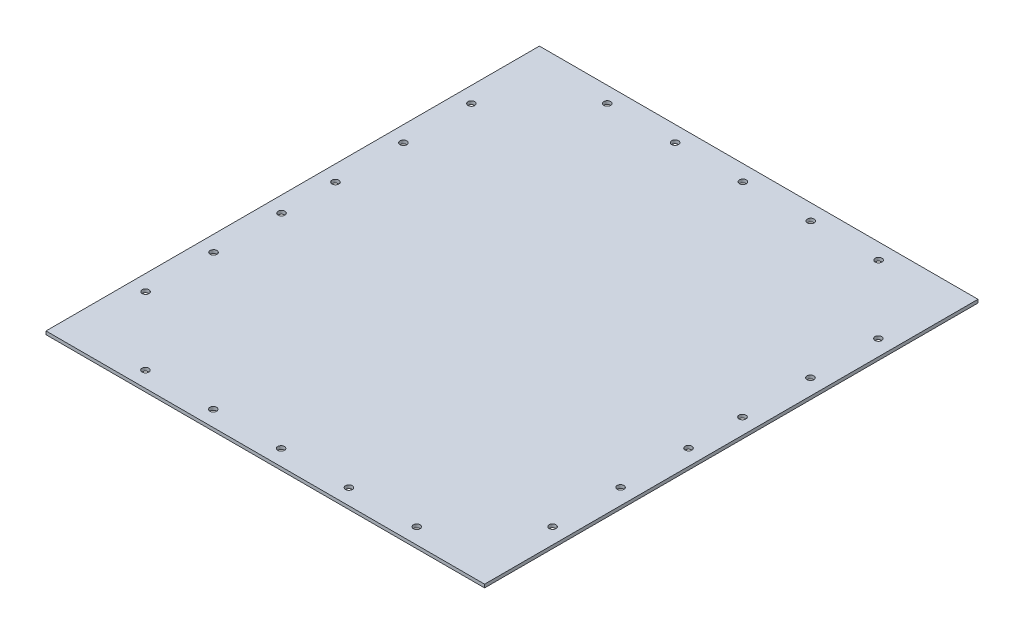
ISO-10303-21;
HEADER;
FILE_DESCRIPTION(('STEP AP214'),'2;1');
FILE_NAME('part.step','',(''),(''),'','','');
FILE_SCHEMA(('AUTOMOTIVE_DESIGN { 1 0 10303 214 1 1 1 1 }'));
ENDSEC;
DATA;
#1=APPLICATION_CONTEXT('core data for automotive mechanical design processes');
#2=APPLICATION_PROTOCOL_DEFINITION('international standard','automotive_design',2000,#1);
#3=PRODUCT_CONTEXT('',#1,'mechanical');
#4=PRODUCT('Part','Part','',(#3));
#5=PRODUCT_RELATED_PRODUCT_CATEGORY('part','',(#4));
#6=PRODUCT_DEFINITION_FORMATION('','',#4);
#7=PRODUCT_DEFINITION_CONTEXT('part definition',#1,'design');
#8=PRODUCT_DEFINITION('design','',#6,#7);
#9=PRODUCT_DEFINITION_SHAPE('','',#8);
#10=(LENGTH_UNIT() NAMED_UNIT(*) SI_UNIT(.MILLI.,.METRE.));
#11=(NAMED_UNIT(*) PLANE_ANGLE_UNIT() SI_UNIT($,.RADIAN.));
#12=(NAMED_UNIT(*) SI_UNIT($,.STERADIAN.) SOLID_ANGLE_UNIT());
#13=UNCERTAINTY_MEASURE_WITH_UNIT(LENGTH_MEASURE(1.E-05),#10,'distance_accuracy_value','');
#14=(GEOMETRIC_REPRESENTATION_CONTEXT(3) GLOBAL_UNCERTAINTY_ASSIGNED_CONTEXT((#13)) GLOBAL_UNIT_ASSIGNED_CONTEXT((#10,
#11,#12)) REPRESENTATION_CONTEXT('',''));
#15=CARTESIAN_POINT('',(0.,0.,0.));
#16=DIRECTION('',(0.,0.,1.));
#17=DIRECTION('',(1.,0.,0.));
#18=AXIS2_PLACEMENT_3D('',#15,#16,#17);
#19=CARTESIAN_POINT('',(200.,53.,0.));
#20=DIRECTION('',(1.,0.,0.));
#21=DIRECTION('',(0.,0.,-1.));
#22=AXIS2_PLACEMENT_3D('',#19,#20,#21);
#23=PLANE('',#22);
#24=DIRECTION('',(0.,0.,1.));
#25=VECTOR('',#24,1.);
#26=CARTESIAN_POINT('',(200.,50.,0.));
#27=LINE('',#26,#25);
#28=CARTESIAN_POINT('',(200.,50.,-225.));
#29=VERTEX_POINT('',#28);
#30=CARTESIAN_POINT('',(200.,50.,225.));
#31=VERTEX_POINT('',#30);
#32=EDGE_CURVE('E180',#29,#31,#27,.T.);
#33=ORIENTED_EDGE('',*,*,#32,.F.);
#34=DIRECTION('',(0.,-1.,0.));
#35=VECTOR('',#34,1.);
#36=CARTESIAN_POINT('',(200.,53.,-225.));
#37=LINE('',#36,#35);
#38=CARTESIAN_POINT('',(200.,53.,-225.));
#39=VERTEX_POINT('',#38);
#40=EDGE_CURVE('E11',#39,#29,#37,.T.);
#41=ORIENTED_EDGE('',*,*,#40,.F.);
#42=DIRECTION('',(0.,0.,1.));
#43=VECTOR('',#42,1.);
#44=CARTESIAN_POINT('',(200.,53.,0.));
#45=LINE('',#44,#43);
#46=CARTESIAN_POINT('',(200.,53.,225.));
#47=VERTEX_POINT('',#46);
#48=EDGE_CURVE('E107',#39,#47,#45,.T.);
#49=ORIENTED_EDGE('',*,*,#48,.T.);
#50=DIRECTION('',(0.,-1.,0.));
#51=VECTOR('',#50,1.);
#52=CARTESIAN_POINT('',(200.,53.,225.));
#53=LINE('',#52,#51);
#54=EDGE_CURVE('E85',#47,#31,#53,.T.);
#55=ORIENTED_EDGE('',*,*,#54,.T.);
#56=EDGE_LOOP('',(#33,#41,#49,#55));
#57=FACE_BOUND('',#56,.T.);
#58=ADVANCED_FACE('F45',(#57),#23,.T.);
#59=CARTESIAN_POINT('',(0.,53.,-225.));
#60=DIRECTION('',(0.,0.,-1.));
#61=DIRECTION('',(-1.,0.,0.));
#62=AXIS2_PLACEMENT_3D('',#59,#60,#61);
#63=PLANE('',#62);
#64=DIRECTION('',(1.,0.,0.));
#65=VECTOR('',#64,1.);
#66=CARTESIAN_POINT('',(0.,50.,-225.));
#67=LINE('',#66,#65);
#68=CARTESIAN_POINT('',(-200.,50.,-225.));
#69=VERTEX_POINT('',#68);
#70=EDGE_CURVE('E97',#69,#29,#67,.T.);
#71=ORIENTED_EDGE('',*,*,#70,.F.);
#72=DIRECTION('',(0.,-1.,0.));
#73=VECTOR('',#72,1.);
#74=CARTESIAN_POINT('',(-200.,53.,-225.));
#75=LINE('',#74,#73);
#76=CARTESIAN_POINT('',(-200.,53.,-225.));
#77=VERTEX_POINT('',#76);
#78=EDGE_CURVE('E54',#77,#69,#75,.T.);
#79=ORIENTED_EDGE('',*,*,#78,.F.);
#80=DIRECTION('',(1.,0.,0.));
#81=VECTOR('',#80,1.);
#82=CARTESIAN_POINT('',(0.,53.,-225.));
#83=LINE('',#82,#81);
#84=EDGE_CURVE('E95',#77,#39,#83,.T.);
#85=ORIENTED_EDGE('',*,*,#84,.T.);
#86=ORIENTED_EDGE('',*,*,#40,.T.);
#87=EDGE_LOOP('',(#71,#79,#85,#86));
#88=FACE_BOUND('',#87,.T.);
#89=ADVANCED_FACE('F93',(#88),#63,.T.);
#90=CARTESIAN_POINT('',(-200.,53.,0.));
#91=DIRECTION('',(1.,0.,0.));
#92=DIRECTION('',(0.,0.,-1.));
#93=AXIS2_PLACEMENT_3D('',#90,#91,#92);
#94=PLANE('',#93);
#95=DIRECTION('',(0.,0.,1.));
#96=VECTOR('',#95,1.);
#97=CARTESIAN_POINT('',(-200.,50.,0.));
#98=LINE('',#97,#96);
#99=CARTESIAN_POINT('',(-200.,50.,225.));
#100=VERTEX_POINT('',#99);
#101=EDGE_CURVE('E183',#69,#100,#98,.T.);
#102=ORIENTED_EDGE('',*,*,#101,.T.);
#103=DIRECTION('',(0.,-1.,0.));
#104=VECTOR('',#103,1.);
#105=CARTESIAN_POINT('',(-200.,53.,225.));
#106=LINE('',#105,#104);
#107=CARTESIAN_POINT('',(-200.,53.,225.));
#108=VERTEX_POINT('',#107);
#109=EDGE_CURVE('E100',#108,#100,#106,.T.);
#110=ORIENTED_EDGE('',*,*,#109,.F.);
#111=DIRECTION('',(0.,0.,1.));
#112=VECTOR('',#111,1.);
#113=CARTESIAN_POINT('',(-200.,53.,0.));
#114=LINE('',#113,#112);
#115=EDGE_CURVE('E102',#77,#108,#114,.T.);
#116=ORIENTED_EDGE('',*,*,#115,.F.);
#117=ORIENTED_EDGE('',*,*,#78,.T.);
#118=EDGE_LOOP('',(#102,#110,#116,#117));
#119=FACE_BOUND('',#118,.T.);
#120=ADVANCED_FACE('F103',(#119),#94,.F.);
#121=CARTESIAN_POINT('',(0.,53.,210.6));
#122=DIRECTION('',(0.,-1.,0.));
#123=DIRECTION('',(0.,0.,-1.));
#124=AXIS2_PLACEMENT_3D('',#121,#122,#123);
#125=CYLINDRICAL_SURFACE('',#124,3.09999999999998);
#126=CARTESIAN_POINT('',(0.,53.,210.6));
#127=DIRECTION('',(0.,1.,0.));
#128=DIRECTION('',(0.,0.,1.));
#129=AXIS2_PLACEMENT_3D('',#126,#127,#128);
#130=CIRCLE('',#129,3.09999999999998);
#131=CARTESIAN_POINT('',(0.,53.,213.7));
#132=VERTEX_POINT('',#131);
#133=EDGE_CURVE('E150',#132,#132,#130,.F.);
#134=ORIENTED_EDGE('',*,*,#133,.F.);
#135=EDGE_LOOP('',(#134));
#136=FACE_BOUND('',#135,.T.);
#137=CARTESIAN_POINT('',(0.,50.,210.6));
#138=DIRECTION('',(0.,1.,0.));
#139=DIRECTION('',(0.,0.,1.));
#140=AXIS2_PLACEMENT_3D('',#137,#138,#139);
#141=CIRCLE('',#140,3.09999999999998);
#142=CARTESIAN_POINT('',(0.,50.,213.7));
#143=VERTEX_POINT('',#142);
#144=EDGE_CURVE('E222',#143,#143,#141,.F.);
#145=ORIENTED_EDGE('',*,*,#144,.T.);
#146=EDGE_LOOP('',(#145));
#147=FACE_BOUND('',#146,.T.);
#148=ADVANCED_FACE('F310',(#136,#147),#125,.F.);
#149=CARTESIAN_POINT('',(123.733333333333,53.,210.6));
#150=DIRECTION('',(0.,-1.,0.));
#151=DIRECTION('',(0.,0.,-1.));
#152=AXIS2_PLACEMENT_3D('',#149,#150,#151);
#153=CYLINDRICAL_SURFACE('',#152,3.09999999999999);
#154=CARTESIAN_POINT('',(123.733333333333,53.,210.6));
#155=DIRECTION('',(0.,1.,0.));
#156=DIRECTION('',(0.,0.,1.));
#157=AXIS2_PLACEMENT_3D('',#154,#155,#156);
#158=CIRCLE('',#157,3.09999999999999);
#159=CARTESIAN_POINT('',(123.733333333333,53.,213.7));
#160=VERTEX_POINT('',#159);
#161=EDGE_CURVE('E147',#160,#160,#158,.F.);
#162=ORIENTED_EDGE('',*,*,#161,.F.);
#163=EDGE_LOOP('',(#162));
#164=FACE_BOUND('',#163,.T.);
#165=CARTESIAN_POINT('',(123.733333333333,50.,210.6));
#166=DIRECTION('',(0.,1.,0.));
#167=DIRECTION('',(0.,0.,1.));
#168=AXIS2_PLACEMENT_3D('',#165,#166,#167);
#169=CIRCLE('',#168,3.09999999999999);
#170=CARTESIAN_POINT('',(123.733333333333,50.,213.7));
#171=VERTEX_POINT('',#170);
#172=EDGE_CURVE('E219',#171,#171,#169,.F.);
#173=ORIENTED_EDGE('',*,*,#172,.T.);
#174=EDGE_LOOP('',(#173));
#175=FACE_BOUND('',#174,.T.);
#176=ADVANCED_FACE('F313',(#164,#175),#153,.F.);
#177=CARTESIAN_POINT('',(185.599999999999,53.,-86.6));
#178=DIRECTION('',(0.,-1.,0.));
#179=DIRECTION('',(0.,0.,-1.));
#180=AXIS2_PLACEMENT_3D('',#177,#178,#179);
#181=CYLINDRICAL_SURFACE('',#180,3.09999999999999);
#182=CARTESIAN_POINT('',(185.599999999999,53.,-86.6));
#183=DIRECTION('',(0.,1.,0.));
#184=DIRECTION('',(0.,0.,1.));
#185=AXIS2_PLACEMENT_3D('',#182,#183,#184);
#186=CIRCLE('',#185,3.09999999999999);
#187=CARTESIAN_POINT('',(185.599999999999,53.,-83.5));
#188=VERTEX_POINT('',#187);
#189=EDGE_CURVE('E144',#188,#188,#186,.F.);
#190=ORIENTED_EDGE('',*,*,#189,.F.);
#191=EDGE_LOOP('',(#190));
#192=FACE_BOUND('',#191,.T.);
#193=CARTESIAN_POINT('',(185.599999999999,50.,-86.6));
#194=DIRECTION('',(0.,1.,0.));
#195=DIRECTION('',(0.,0.,1.));
#196=AXIS2_PLACEMENT_3D('',#193,#194,#195);
#197=CIRCLE('',#196,3.09999999999999);
#198=CARTESIAN_POINT('',(185.599999999999,50.,-83.5));
#199=VERTEX_POINT('',#198);
#200=EDGE_CURVE('E216',#199,#199,#197,.F.);
#201=ORIENTED_EDGE('',*,*,#200,.T.);
#202=EDGE_LOOP('',(#201));
#203=FACE_BOUND('',#202,.T.);
#204=ADVANCED_FACE('F317',(#192,#203),#181,.F.);
#205=CARTESIAN_POINT('',(-185.599999999999,53.,148.6));
#206=DIRECTION('',(0.,-1.,0.));
#207=DIRECTION('',(0.,0.,-1.));
#208=AXIS2_PLACEMENT_3D('',#205,#206,#207);
#209=CYLINDRICAL_SURFACE('',#208,3.09999999999999);
#210=CARTESIAN_POINT('',(-185.599999999999,53.,148.6));
#211=DIRECTION('',(0.,1.,0.));
#212=DIRECTION('',(0.,0.,1.));
#213=AXIS2_PLACEMENT_3D('',#210,#211,#212);
#214=CIRCLE('',#213,3.09999999999999);
#215=CARTESIAN_POINT('',(-185.599999999999,53.,151.7));
#216=VERTEX_POINT('',#215);
#217=EDGE_CURVE('E141',#216,#216,#214,.F.);
#218=ORIENTED_EDGE('',*,*,#217,.F.);
#219=EDGE_LOOP('',(#218));
#220=FACE_BOUND('',#219,.T.);
#221=CARTESIAN_POINT('',(-185.599999999999,50.,148.6));
#222=DIRECTION('',(0.,1.,0.));
#223=DIRECTION('',(0.,0.,1.));
#224=AXIS2_PLACEMENT_3D('',#221,#222,#223);
#225=CIRCLE('',#224,3.09999999999999);
#226=CARTESIAN_POINT('',(-185.599999999999,50.,151.7));
#227=VERTEX_POINT('',#226);
#228=EDGE_CURVE('E213',#227,#227,#225,.F.);
#229=ORIENTED_EDGE('',*,*,#228,.T.);
#230=EDGE_LOOP('',(#229));
#231=FACE_BOUND('',#230,.T.);
#232=ADVANCED_FACE('F321',(#220,#231),#209,.F.);
#233=CARTESIAN_POINT('',(-185.599999999998,53.,24.6));
#234=DIRECTION('',(0.,-1.,0.));
#235=DIRECTION('',(0.,0.,-1.));
#236=AXIS2_PLACEMENT_3D('',#233,#234,#235);
#237=CYLINDRICAL_SURFACE('',#236,3.09999999999999);
#238=CARTESIAN_POINT('',(-185.599999999998,53.,24.6));
#239=DIRECTION('',(0.,1.,0.));
#240=DIRECTION('',(0.,0.,1.));
#241=AXIS2_PLACEMENT_3D('',#238,#239,#240);
#242=CIRCLE('',#241,3.09999999999999);
#243=CARTESIAN_POINT('',(-185.599999999998,53.,27.7));
#244=VERTEX_POINT('',#243);
#245=EDGE_CURVE('E138',#244,#244,#242,.F.);
#246=ORIENTED_EDGE('',*,*,#245,.F.);
#247=EDGE_LOOP('',(#246));
#248=FACE_BOUND('',#247,.T.);
#249=CARTESIAN_POINT('',(-185.599999999998,50.,24.6));
#250=DIRECTION('',(0.,1.,0.));
#251=DIRECTION('',(0.,0.,1.));
#252=AXIS2_PLACEMENT_3D('',#249,#250,#251);
#253=CIRCLE('',#252,3.09999999999999);
#254=CARTESIAN_POINT('',(-185.599999999998,50.,27.7));
#255=VERTEX_POINT('',#254);
#256=EDGE_CURVE('E210',#255,#255,#253,.F.);
#257=ORIENTED_EDGE('',*,*,#256,.T.);
#258=EDGE_LOOP('',(#257));
#259=FACE_BOUND('',#258,.T.);
#260=ADVANCED_FACE('F325',(#248,#259),#237,.F.);
#261=CARTESIAN_POINT('',(-185.599999999998,53.,-24.6));
#262=DIRECTION('',(0.,-1.,0.));
#263=DIRECTION('',(0.,0.,-1.));
#264=AXIS2_PLACEMENT_3D('',#261,#262,#263);
#265=CYLINDRICAL_SURFACE('',#264,3.09999999999999);
#266=CARTESIAN_POINT('',(-185.599999999998,53.,-24.6));
#267=DIRECTION('',(0.,1.,0.));
#268=DIRECTION('',(0.,0.,1.));
#269=AXIS2_PLACEMENT_3D('',#266,#267,#268);
#270=CIRCLE('',#269,3.09999999999999);
#271=CARTESIAN_POINT('',(-185.599999999998,53.,-21.5));
#272=VERTEX_POINT('',#271);
#273=EDGE_CURVE('E135',#272,#272,#270,.T.);
#274=ORIENTED_EDGE('',*,*,#273,.T.);
#275=EDGE_LOOP('',(#274));
#276=FACE_BOUND('',#275,.T.);
#277=CARTESIAN_POINT('',(-185.599999999998,50.,-24.6));
#278=DIRECTION('',(0.,1.,0.));
#279=DIRECTION('',(0.,0.,1.));
#280=AXIS2_PLACEMENT_3D('',#277,#278,#279);
#281=CIRCLE('',#280,3.09999999999999);
#282=CARTESIAN_POINT('',(-185.599999999998,50.,-21.5));
#283=VERTEX_POINT('',#282);
#284=EDGE_CURVE('E207',#283,#283,#281,.T.);
#285=ORIENTED_EDGE('',*,*,#284,.F.);
#286=EDGE_LOOP('',(#285));
#287=FACE_BOUND('',#286,.T.);
#288=ADVANCED_FACE('F329',(#276,#287),#265,.F.);
#289=CARTESIAN_POINT('',(-185.599999999999,53.,-86.6));
#290=DIRECTION('',(0.,-1.,0.));
#291=DIRECTION('',(0.,0.,-1.));
#292=AXIS2_PLACEMENT_3D('',#289,#290,#291);
#293=CYLINDRICAL_SURFACE('',#292,3.09999999999999);
#294=CARTESIAN_POINT('',(-185.599999999999,53.,-86.6));
#295=DIRECTION('',(0.,1.,0.));
#296=DIRECTION('',(0.,0.,1.));
#297=AXIS2_PLACEMENT_3D('',#294,#295,#296);
#298=CIRCLE('',#297,3.09999999999999);
#299=CARTESIAN_POINT('',(-185.599999999999,53.,-83.5));
#300=VERTEX_POINT('',#299);
#301=EDGE_CURVE('E132',#300,#300,#298,.T.);
#302=ORIENTED_EDGE('',*,*,#301,.T.);
#303=EDGE_LOOP('',(#302));
#304=FACE_BOUND('',#303,.T.);
#305=CARTESIAN_POINT('',(-185.599999999999,50.,-86.6));
#306=DIRECTION('',(0.,1.,0.));
#307=DIRECTION('',(0.,0.,1.));
#308=AXIS2_PLACEMENT_3D('',#305,#306,#307);
#309=CIRCLE('',#308,3.09999999999999);
#310=CARTESIAN_POINT('',(-185.599999999999,50.,-83.5));
#311=VERTEX_POINT('',#310);
#312=EDGE_CURVE('E204',#311,#311,#309,.T.);
#313=ORIENTED_EDGE('',*,*,#312,.F.);
#314=EDGE_LOOP('',(#313));
#315=FACE_BOUND('',#314,.T.);
#316=ADVANCED_FACE('F333',(#304,#315),#293,.F.);
#317=CARTESIAN_POINT('',(-185.599999999999,53.,-148.6));
#318=DIRECTION('',(0.,-1.,0.));
#319=DIRECTION('',(0.,0.,-1.));
#320=AXIS2_PLACEMENT_3D('',#317,#318,#319);
#321=CYLINDRICAL_SURFACE('',#320,3.09999999999999);
#322=CARTESIAN_POINT('',(-185.599999999999,53.,-148.6));
#323=DIRECTION('',(0.,1.,0.));
#324=DIRECTION('',(0.,0.,1.));
#325=AXIS2_PLACEMENT_3D('',#322,#323,#324);
#326=CIRCLE('',#325,3.09999999999999);
#327=CARTESIAN_POINT('',(-185.599999999999,53.,-145.5));
#328=VERTEX_POINT('',#327);
#329=EDGE_CURVE('E129',#328,#328,#326,.T.);
#330=ORIENTED_EDGE('',*,*,#329,.T.);
#331=EDGE_LOOP('',(#330));
#332=FACE_BOUND('',#331,.T.);
#333=CARTESIAN_POINT('',(-185.599999999999,50.,-148.6));
#334=DIRECTION('',(0.,1.,0.));
#335=DIRECTION('',(0.,0.,1.));
#336=AXIS2_PLACEMENT_3D('',#333,#334,#335);
#337=CIRCLE('',#336,3.09999999999999);
#338=CARTESIAN_POINT('',(-185.599999999999,50.,-145.5));
#339=VERTEX_POINT('',#338);
#340=EDGE_CURVE('E201',#339,#339,#337,.T.);
#341=ORIENTED_EDGE('',*,*,#340,.F.);
#342=EDGE_LOOP('',(#341));
#343=FACE_BOUND('',#342,.T.);
#344=ADVANCED_FACE('F337',(#332,#343),#321,.F.);
#345=CARTESIAN_POINT('',(123.733333333333,53.,-210.6));
#346=DIRECTION('',(0.,-1.,0.));
#347=DIRECTION('',(0.,0.,-1.));
#348=AXIS2_PLACEMENT_3D('',#345,#346,#347);
#349=CYLINDRICAL_SURFACE('',#348,3.09999999999999);
#350=CARTESIAN_POINT('',(123.733333333333,53.,-210.6));
#351=DIRECTION('',(0.,1.,0.));
#352=DIRECTION('',(0.,0.,1.));
#353=AXIS2_PLACEMENT_3D('',#350,#351,#352);
#354=CIRCLE('',#353,3.09999999999999);
#355=CARTESIAN_POINT('',(123.733333333333,53.,-207.5));
#356=VERTEX_POINT('',#355);
#357=EDGE_CURVE('E126',#356,#356,#354,.T.);
#358=ORIENTED_EDGE('',*,*,#357,.T.);
#359=EDGE_LOOP('',(#358));
#360=FACE_BOUND('',#359,.T.);
#361=CARTESIAN_POINT('',(123.733333333333,50.,-210.6));
#362=DIRECTION('',(0.,1.,0.));
#363=DIRECTION('',(0.,0.,1.));
#364=AXIS2_PLACEMENT_3D('',#361,#362,#363);
#365=CIRCLE('',#364,3.09999999999999);
#366=CARTESIAN_POINT('',(123.733333333333,50.,-207.5));
#367=VERTEX_POINT('',#366);
#368=EDGE_CURVE('E198',#367,#367,#365,.T.);
#369=ORIENTED_EDGE('',*,*,#368,.F.);
#370=EDGE_LOOP('',(#369));
#371=FACE_BOUND('',#370,.T.);
#372=ADVANCED_FACE('F341',(#360,#371),#349,.F.);
#373=CARTESIAN_POINT('',(61.8666666666666,53.,-210.6));
#374=DIRECTION('',(0.,-1.,0.));
#375=DIRECTION('',(0.,0.,-1.));
#376=AXIS2_PLACEMENT_3D('',#373,#374,#375);
#377=CYLINDRICAL_SURFACE('',#376,3.09999999999999);
#378=CARTESIAN_POINT('',(61.8666666666666,53.,-210.6));
#379=DIRECTION('',(0.,1.,0.));
#380=DIRECTION('',(0.,0.,1.));
#381=AXIS2_PLACEMENT_3D('',#378,#379,#380);
#382=CIRCLE('',#381,3.09999999999999);
#383=CARTESIAN_POINT('',(61.8666666666666,53.,-207.5));
#384=VERTEX_POINT('',#383);
#385=EDGE_CURVE('E123',#384,#384,#382,.T.);
#386=ORIENTED_EDGE('',*,*,#385,.T.);
#387=EDGE_LOOP('',(#386));
#388=FACE_BOUND('',#387,.T.);
#389=CARTESIAN_POINT('',(61.8666666666666,50.,-210.6));
#390=DIRECTION('',(0.,1.,0.));
#391=DIRECTION('',(0.,0.,1.));
#392=AXIS2_PLACEMENT_3D('',#389,#390,#391);
#393=CIRCLE('',#392,3.09999999999999);
#394=CARTESIAN_POINT('',(61.8666666666666,50.,-207.5));
#395=VERTEX_POINT('',#394);
#396=EDGE_CURVE('E195',#395,#395,#393,.T.);
#397=ORIENTED_EDGE('',*,*,#396,.F.);
#398=EDGE_LOOP('',(#397));
#399=FACE_BOUND('',#398,.T.);
#400=ADVANCED_FACE('F345',(#388,#399),#377,.F.);
#401=CARTESIAN_POINT('',(0.,53.,-210.6));
#402=DIRECTION('',(0.,-1.,0.));
#403=DIRECTION('',(0.,0.,-1.));
#404=AXIS2_PLACEMENT_3D('',#401,#402,#403);
#405=CYLINDRICAL_SURFACE('',#404,3.09999999999998);
#406=CARTESIAN_POINT('',(0.,53.,-210.6));
#407=DIRECTION('',(0.,1.,0.));
#408=DIRECTION('',(0.,0.,1.));
#409=AXIS2_PLACEMENT_3D('',#406,#407,#408);
#410=CIRCLE('',#409,3.09999999999998);
#411=CARTESIAN_POINT('',(0.,53.,-207.5));
#412=VERTEX_POINT('',#411);
#413=EDGE_CURVE('E120',#412,#412,#410,.T.);
#414=ORIENTED_EDGE('',*,*,#413,.T.);
#415=EDGE_LOOP('',(#414));
#416=FACE_BOUND('',#415,.T.);
#417=CARTESIAN_POINT('',(0.,50.,-210.6));
#418=DIRECTION('',(0.,1.,0.));
#419=DIRECTION('',(0.,0.,1.));
#420=AXIS2_PLACEMENT_3D('',#417,#418,#419);
#421=CIRCLE('',#420,3.09999999999998);
#422=CARTESIAN_POINT('',(0.,50.,-207.5));
#423=VERTEX_POINT('',#422);
#424=EDGE_CURVE('E192',#423,#423,#421,.T.);
#425=ORIENTED_EDGE('',*,*,#424,.F.);
#426=EDGE_LOOP('',(#425));
#427=FACE_BOUND('',#426,.T.);
#428=ADVANCED_FACE('F349',(#416,#427),#405,.F.);
#429=CARTESIAN_POINT('',(-61.8666666666666,53.,-210.6));
#430=DIRECTION('',(0.,-1.,0.));
#431=DIRECTION('',(0.,0.,-1.));
#432=AXIS2_PLACEMENT_3D('',#429,#430,#431);
#433=CYLINDRICAL_SURFACE('',#432,3.09999999999999);
#434=CARTESIAN_POINT('',(-61.8666666666666,53.,-210.6));
#435=DIRECTION('',(0.,1.,0.));
#436=DIRECTION('',(0.,0.,1.));
#437=AXIS2_PLACEMENT_3D('',#434,#435,#436);
#438=CIRCLE('',#437,3.09999999999999);
#439=CARTESIAN_POINT('',(-61.8666666666666,53.,-207.5));
#440=VERTEX_POINT('',#439);
#441=EDGE_CURVE('E117',#440,#440,#438,.T.);
#442=ORIENTED_EDGE('',*,*,#441,.T.);
#443=EDGE_LOOP('',(#442));
#444=FACE_BOUND('',#443,.T.);
#445=CARTESIAN_POINT('',(-61.8666666666666,50.,-210.6));
#446=DIRECTION('',(0.,1.,0.));
#447=DIRECTION('',(0.,0.,1.));
#448=AXIS2_PLACEMENT_3D('',#445,#446,#447);
#449=CIRCLE('',#448,3.09999999999999);
#450=CARTESIAN_POINT('',(-61.8666666666666,50.,-207.5));
#451=VERTEX_POINT('',#450);
#452=EDGE_CURVE('E189',#451,#451,#449,.T.);
#453=ORIENTED_EDGE('',*,*,#452,.F.);
#454=EDGE_LOOP('',(#453));
#455=FACE_BOUND('',#454,.T.);
#456=ADVANCED_FACE('F353',(#444,#455),#433,.F.);
#457=CARTESIAN_POINT('',(-123.733333333333,53.,-210.6));
#458=DIRECTION('',(0.,-1.,0.));
#459=DIRECTION('',(0.,0.,-1.));
#460=AXIS2_PLACEMENT_3D('',#457,#458,#459);
#461=CYLINDRICAL_SURFACE('',#460,3.09999999999999);
#462=CARTESIAN_POINT('',(-123.733333333333,53.,-210.6));
#463=DIRECTION('',(0.,1.,0.));
#464=DIRECTION('',(0.,0.,1.));
#465=AXIS2_PLACEMENT_3D('',#462,#463,#464);
#466=CIRCLE('',#465,3.09999999999999);
#467=CARTESIAN_POINT('',(-123.733333333333,53.,-207.5));
#468=VERTEX_POINT('',#467);
#469=EDGE_CURVE('E114',#468,#468,#466,.T.);
#470=ORIENTED_EDGE('',*,*,#469,.T.);
#471=EDGE_LOOP('',(#470));
#472=FACE_BOUND('',#471,.T.);
#473=CARTESIAN_POINT('',(-123.733333333333,50.,-210.6));
#474=DIRECTION('',(0.,1.,0.));
#475=DIRECTION('',(0.,0.,1.));
#476=AXIS2_PLACEMENT_3D('',#473,#474,#475);
#477=CIRCLE('',#476,3.09999999999999);
#478=CARTESIAN_POINT('',(-123.733333333333,50.,-207.5));
#479=VERTEX_POINT('',#478);
#480=EDGE_CURVE('E186',#479,#479,#477,.T.);
#481=ORIENTED_EDGE('',*,*,#480,.F.);
#482=EDGE_LOOP('',(#481));
#483=FACE_BOUND('',#482,.T.);
#484=ADVANCED_FACE('F357',(#472,#483),#461,.F.);
#485=CARTESIAN_POINT('',(0.,53.,225.));
#486=DIRECTION('',(0.,0.,-1.));
#487=DIRECTION('',(-1.,0.,0.));
#488=AXIS2_PLACEMENT_3D('',#485,#486,#487);
#489=PLANE('',#488);
#490=DIRECTION('',(1.,0.,0.));
#491=VECTOR('',#490,1.);
#492=CARTESIAN_POINT('',(0.,50.,225.));
#493=LINE('',#492,#491);
#494=EDGE_CURVE('E78',#100,#31,#493,.T.);
#495=ORIENTED_EDGE('',*,*,#494,.T.);
#496=ORIENTED_EDGE('',*,*,#54,.F.);
#497=DIRECTION('',(1.,0.,0.));
#498=VECTOR('',#497,1.);
#499=CARTESIAN_POINT('',(0.,53.,225.));
#500=LINE('',#499,#498);
#501=EDGE_CURVE('E62',#108,#47,#500,.T.);
#502=ORIENTED_EDGE('',*,*,#501,.F.);
#503=ORIENTED_EDGE('',*,*,#109,.T.);
#504=EDGE_LOOP('',(#495,#496,#502,#503));
#505=FACE_BOUND('',#504,.T.);
#506=ADVANCED_FACE('F231',(#505),#489,.F.);
#507=CARTESIAN_POINT('',(-185.599999999999,53.,86.6));
#508=DIRECTION('',(0.,-1.,0.));
#509=DIRECTION('',(0.,0.,-1.));
#510=AXIS2_PLACEMENT_3D('',#507,#508,#509);
#511=CYLINDRICAL_SURFACE('',#510,3.09999999999999);
#512=CARTESIAN_POINT('',(-185.599999999999,53.,86.6));
#513=DIRECTION('',(0.,1.,0.));
#514=DIRECTION('',(0.,0.,1.));
#515=AXIS2_PLACEMENT_3D('',#512,#513,#514);
#516=CIRCLE('',#515,3.09999999999999);
#517=CARTESIAN_POINT('',(-185.599999999999,53.,89.7));
#518=VERTEX_POINT('',#517);
#519=EDGE_CURVE('E109',#518,#518,#516,.F.);
#520=ORIENTED_EDGE('',*,*,#519,.F.);
#521=EDGE_LOOP('',(#520));
#522=FACE_BOUND('',#521,.T.);
#523=CARTESIAN_POINT('',(-185.599999999999,50.,86.6));
#524=DIRECTION('',(0.,1.,0.));
#525=DIRECTION('',(0.,0.,1.));
#526=AXIS2_PLACEMENT_3D('',#523,#524,#525);
#527=CIRCLE('',#526,3.09999999999999);
#528=CARTESIAN_POINT('',(-185.599999999999,50.,89.7));
#529=VERTEX_POINT('',#528);
#530=EDGE_CURVE('E177',#529,#529,#527,.F.);
#531=ORIENTED_EDGE('',*,*,#530,.T.);
#532=EDGE_LOOP('',(#531));
#533=FACE_BOUND('',#532,.T.);
#534=ADVANCED_FACE('F242',(#522,#533),#511,.F.);
#535=CARTESIAN_POINT('',(185.599999999999,53.,148.6));
#536=DIRECTION('',(0.,-1.,0.));
#537=DIRECTION('',(0.,0.,-1.));
#538=AXIS2_PLACEMENT_3D('',#535,#536,#537);
#539=CYLINDRICAL_SURFACE('',#538,3.09999999999999);
#540=CARTESIAN_POINT('',(185.599999999999,53.,148.6));
#541=DIRECTION('',(0.,1.,0.));
#542=DIRECTION('',(0.,0.,1.));
#543=AXIS2_PLACEMENT_3D('',#540,#541,#542);
#544=CIRCLE('',#543,3.09999999999999);
#545=CARTESIAN_POINT('',(185.599999999999,53.,151.7));
#546=VERTEX_POINT('',#545);
#547=EDGE_CURVE('E618',#546,#546,#544,.T.);
#548=ORIENTED_EDGE('',*,*,#547,.T.);
#549=EDGE_LOOP('',(#548));
#550=FACE_BOUND('',#549,.T.);
#551=CARTESIAN_POINT('',(185.599999999999,50.,148.6));
#552=DIRECTION('',(0.,1.,0.));
#553=DIRECTION('',(0.,0.,1.));
#554=AXIS2_PLACEMENT_3D('',#551,#552,#553);
#555=CIRCLE('',#554,3.09999999999999);
#556=CARTESIAN_POINT('',(185.599999999999,50.,151.7));
#557=VERTEX_POINT('',#556);
#558=EDGE_CURVE('E174',#557,#557,#555,.T.);
#559=ORIENTED_EDGE('',*,*,#558,.F.);
#560=EDGE_LOOP('',(#559));
#561=FACE_BOUND('',#560,.T.);
#562=ADVANCED_FACE('F245',(#550,#561),#539,.F.);
#563=CARTESIAN_POINT('',(185.599999999999,53.,86.6));
#564=DIRECTION('',(0.,-1.,0.));
#565=DIRECTION('',(0.,0.,-1.));
#566=AXIS2_PLACEMENT_3D('',#563,#564,#565);
#567=CYLINDRICAL_SURFACE('',#566,3.09999999999999);
#568=CARTESIAN_POINT('',(185.599999999999,53.,86.6));
#569=DIRECTION('',(0.,1.,0.));
#570=DIRECTION('',(0.,0.,1.));
#571=AXIS2_PLACEMENT_3D('',#568,#569,#570);
#572=CIRCLE('',#571,3.09999999999999);
#573=CARTESIAN_POINT('',(185.599999999999,53.,89.7));
#574=VERTEX_POINT('',#573);
#575=EDGE_CURVE('E614',#574,#574,#572,.T.);
#576=ORIENTED_EDGE('',*,*,#575,.T.);
#577=EDGE_LOOP('',(#576));
#578=FACE_BOUND('',#577,.T.);
#579=CARTESIAN_POINT('',(185.599999999999,50.,86.6));
#580=DIRECTION('',(0.,1.,0.));
#581=DIRECTION('',(0.,0.,1.));
#582=AXIS2_PLACEMENT_3D('',#579,#580,#581);
#583=CIRCLE('',#582,3.09999999999999);
#584=CARTESIAN_POINT('',(185.599999999999,50.,89.7));
#585=VERTEX_POINT('',#584);
#586=EDGE_CURVE('E171',#585,#585,#583,.T.);
#587=ORIENTED_EDGE('',*,*,#586,.F.);
#588=EDGE_LOOP('',(#587));
#589=FACE_BOUND('',#588,.T.);
#590=ADVANCED_FACE('F249',(#578,#589),#567,.F.);
#591=CARTESIAN_POINT('',(185.599999999998,53.,24.6));
#592=DIRECTION('',(0.,-1.,0.));
#593=DIRECTION('',(0.,0.,-1.));
#594=AXIS2_PLACEMENT_3D('',#591,#592,#593);
#595=CYLINDRICAL_SURFACE('',#594,3.09999999999999);
#596=CARTESIAN_POINT('',(185.599999999998,53.,24.6));
#597=DIRECTION('',(0.,1.,0.));
#598=DIRECTION('',(0.,0.,1.));
#599=AXIS2_PLACEMENT_3D('',#596,#597,#598);
#600=CIRCLE('',#599,3.09999999999999);
#601=CARTESIAN_POINT('',(185.599999999998,53.,27.7));
#602=VERTEX_POINT('',#601);
#603=EDGE_CURVE('E610',#602,#602,#600,.T.);
#604=ORIENTED_EDGE('',*,*,#603,.T.);
#605=EDGE_LOOP('',(#604));
#606=FACE_BOUND('',#605,.T.);
#607=CARTESIAN_POINT('',(185.599999999998,50.,24.6));
#608=DIRECTION('',(0.,1.,0.));
#609=DIRECTION('',(0.,0.,1.));
#610=AXIS2_PLACEMENT_3D('',#607,#608,#609);
#611=CIRCLE('',#610,3.09999999999999);
#612=CARTESIAN_POINT('',(185.599999999998,50.,27.7));
#613=VERTEX_POINT('',#612);
#614=EDGE_CURVE('E168',#613,#613,#611,.T.);
#615=ORIENTED_EDGE('',*,*,#614,.F.);
#616=EDGE_LOOP('',(#615));
#617=FACE_BOUND('',#616,.T.);
#618=ADVANCED_FACE('F253',(#606,#617),#595,.F.);
#619=CARTESIAN_POINT('',(185.599999999998,53.,-24.6));
#620=DIRECTION('',(0.,-1.,0.));
#621=DIRECTION('',(0.,0.,-1.));
#622=AXIS2_PLACEMENT_3D('',#619,#620,#621);
#623=CYLINDRICAL_SURFACE('',#622,3.09999999999999);
#624=CARTESIAN_POINT('',(185.599999999998,53.,-24.6));
#625=DIRECTION('',(0.,1.,0.));
#626=DIRECTION('',(0.,0.,1.));
#627=AXIS2_PLACEMENT_3D('',#624,#625,#626);
#628=CIRCLE('',#627,3.09999999999999);
#629=CARTESIAN_POINT('',(185.599999999998,53.,-21.5));
#630=VERTEX_POINT('',#629);
#631=EDGE_CURVE('E606',#630,#630,#628,.F.);
#632=ORIENTED_EDGE('',*,*,#631,.F.);
#633=EDGE_LOOP('',(#632));
#634=FACE_BOUND('',#633,.T.);
#635=CARTESIAN_POINT('',(185.599999999998,50.,-24.6));
#636=DIRECTION('',(0.,1.,0.));
#637=DIRECTION('',(0.,0.,1.));
#638=AXIS2_PLACEMENT_3D('',#635,#636,#637);
#639=CIRCLE('',#638,3.09999999999999);
#640=CARTESIAN_POINT('',(185.599999999998,50.,-21.5));
#641=VERTEX_POINT('',#640);
#642=EDGE_CURVE('E165',#641,#641,#639,.F.);
#643=ORIENTED_EDGE('',*,*,#642,.T.);
#644=EDGE_LOOP('',(#643));
#645=FACE_BOUND('',#644,.T.);
#646=ADVANCED_FACE('F257',(#634,#645),#623,.F.);
#647=CARTESIAN_POINT('',(185.599999999999,53.,-148.6));
#648=DIRECTION('',(0.,-1.,0.));
#649=DIRECTION('',(0.,0.,-1.));
#650=AXIS2_PLACEMENT_3D('',#647,#648,#649);
#651=CYLINDRICAL_SURFACE('',#650,3.09999999999999);
#652=CARTESIAN_POINT('',(185.599999999999,53.,-148.6));
#653=DIRECTION('',(0.,1.,0.));
#654=DIRECTION('',(0.,0.,1.));
#655=AXIS2_PLACEMENT_3D('',#652,#653,#654);
#656=CIRCLE('',#655,3.09999999999999);
#657=CARTESIAN_POINT('',(185.599999999999,53.,-145.5));
#658=VERTEX_POINT('',#657);
#659=EDGE_CURVE('E602',#658,#658,#656,.F.);
#660=ORIENTED_EDGE('',*,*,#659,.F.);
#661=EDGE_LOOP('',(#660));
#662=FACE_BOUND('',#661,.T.);
#663=CARTESIAN_POINT('',(185.599999999999,50.,-148.6));
#664=DIRECTION('',(0.,1.,0.));
#665=DIRECTION('',(0.,0.,1.));
#666=AXIS2_PLACEMENT_3D('',#663,#664,#665);
#667=CIRCLE('',#666,3.09999999999999);
#668=CARTESIAN_POINT('',(185.599999999999,50.,-145.5));
#669=VERTEX_POINT('',#668);
#670=EDGE_CURVE('E162',#669,#669,#667,.F.);
#671=ORIENTED_EDGE('',*,*,#670,.T.);
#672=EDGE_LOOP('',(#671));
#673=FACE_BOUND('',#672,.T.);
#674=ADVANCED_FACE('F261',(#662,#673),#651,.F.);
#675=CARTESIAN_POINT('',(61.8666666666666,53.,210.6));
#676=DIRECTION('',(0.,-1.,0.));
#677=DIRECTION('',(0.,0.,-1.));
#678=AXIS2_PLACEMENT_3D('',#675,#676,#677);
#679=CYLINDRICAL_SURFACE('',#678,3.09999999999999);
#680=CARTESIAN_POINT('',(61.8666666666666,53.,210.6));
#681=DIRECTION('',(0.,1.,0.));
#682=DIRECTION('',(0.,0.,1.));
#683=AXIS2_PLACEMENT_3D('',#680,#681,#682);
#684=CIRCLE('',#683,3.09999999999999);
#685=CARTESIAN_POINT('',(61.8666666666666,53.,213.7));
#686=VERTEX_POINT('',#685);
#687=EDGE_CURVE('E276',#686,#686,#684,.F.);
#688=ORIENTED_EDGE('',*,*,#687,.F.);
#689=EDGE_LOOP('',(#688));
#690=FACE_BOUND('',#689,.T.);
#691=CARTESIAN_POINT('',(61.8666666666666,50.,210.6));
#692=DIRECTION('',(0.,1.,0.));
#693=DIRECTION('',(0.,0.,1.));
#694=AXIS2_PLACEMENT_3D('',#691,#692,#693);
#695=CIRCLE('',#694,3.09999999999999);
#696=CARTESIAN_POINT('',(61.8666666666666,50.,213.7));
#697=VERTEX_POINT('',#696);
#698=EDGE_CURVE('E159',#697,#697,#695,.F.);
#699=ORIENTED_EDGE('',*,*,#698,.T.);
#700=EDGE_LOOP('',(#699));
#701=FACE_BOUND('',#700,.T.);
#702=ADVANCED_FACE('F264',(#690,#701),#679,.F.);
#703=CARTESIAN_POINT('',(-61.8666666666666,53.,210.6));
#704=DIRECTION('',(0.,-1.,0.));
#705=DIRECTION('',(0.,0.,-1.));
#706=AXIS2_PLACEMENT_3D('',#703,#704,#705);
#707=CYLINDRICAL_SURFACE('',#706,3.09999999999999);
#708=CARTESIAN_POINT('',(-61.8666666666666,53.,210.6));
#709=DIRECTION('',(0.,1.,0.));
#710=DIRECTION('',(0.,0.,1.));
#711=AXIS2_PLACEMENT_3D('',#708,#709,#710);
#712=CIRCLE('',#711,3.09999999999999);
#713=CARTESIAN_POINT('',(-61.8666666666666,53.,213.7));
#714=VERTEX_POINT('',#713);
#715=EDGE_CURVE('E228',#714,#714,#712,.F.);
#716=ORIENTED_EDGE('',*,*,#715,.F.);
#717=EDGE_LOOP('',(#716));
#718=FACE_BOUND('',#717,.T.);
#719=CARTESIAN_POINT('',(-61.8666666666666,50.,210.6));
#720=DIRECTION('',(0.,1.,0.));
#721=DIRECTION('',(0.,0.,1.));
#722=AXIS2_PLACEMENT_3D('',#719,#720,#721);
#723=CIRCLE('',#722,3.09999999999999);
#724=CARTESIAN_POINT('',(-61.8666666666666,50.,213.7));
#725=VERTEX_POINT('',#724);
#726=EDGE_CURVE('E156',#725,#725,#723,.F.);
#727=ORIENTED_EDGE('',*,*,#726,.T.);
#728=EDGE_LOOP('',(#727));
#729=FACE_BOUND('',#728,.T.);
#730=ADVANCED_FACE('F47',(#718,#729),#707,.F.);
#731=CARTESIAN_POINT('',(-123.733333333333,53.,210.6));
#732=DIRECTION('',(0.,-1.,0.));
#733=DIRECTION('',(0.,0.,-1.));
#734=AXIS2_PLACEMENT_3D('',#731,#732,#733);
#735=CYLINDRICAL_SURFACE('',#734,3.09999999999999);
#736=CARTESIAN_POINT('',(-123.733333333333,53.,210.6));
#737=DIRECTION('',(0.,1.,0.));
#738=DIRECTION('',(0.,0.,1.));
#739=AXIS2_PLACEMENT_3D('',#736,#737,#738);
#740=CIRCLE('',#739,3.09999999999999);
#741=CARTESIAN_POINT('',(-123.733333333333,53.,213.7));
#742=VERTEX_POINT('',#741);
#743=EDGE_CURVE('E153',#742,#742,#740,.F.);
#744=ORIENTED_EDGE('',*,*,#743,.F.);
#745=EDGE_LOOP('',(#744));
#746=FACE_BOUND('',#745,.T.);
#747=CARTESIAN_POINT('',(-123.733333333333,50.,210.6));
#748=DIRECTION('',(0.,1.,0.));
#749=DIRECTION('',(0.,0.,1.));
#750=AXIS2_PLACEMENT_3D('',#747,#748,#749);
#751=CIRCLE('',#750,3.09999999999999);
#752=CARTESIAN_POINT('',(-123.733333333333,50.,213.7));
#753=VERTEX_POINT('',#752);
#754=EDGE_CURVE('E225',#753,#753,#751,.F.);
#755=ORIENTED_EDGE('',*,*,#754,.T.);
#756=EDGE_LOOP('',(#755));
#757=FACE_BOUND('',#756,.T.);
#758=ADVANCED_FACE('F271',(#746,#757),#735,.F.);
#759=CARTESIAN_POINT('',(0.,53.,0.));
#760=DIRECTION('',(0.,1.,0.));
#761=DIRECTION('',(0.,0.,1.));
#762=AXIS2_PLACEMENT_3D('',#759,#760,#761);
#763=PLANE('',#762);
#764=ORIENTED_EDGE('',*,*,#715,.T.);
#765=EDGE_LOOP('',(#764));
#766=FACE_BOUND('',#765,.T.);
#767=ORIENTED_EDGE('',*,*,#687,.T.);
#768=EDGE_LOOP('',(#767));
#769=FACE_BOUND('',#768,.T.);
#770=ORIENTED_EDGE('',*,*,#659,.T.);
#771=EDGE_LOOP('',(#770));
#772=FACE_BOUND('',#771,.T.);
#773=ORIENTED_EDGE('',*,*,#631,.T.);
#774=EDGE_LOOP('',(#773));
#775=FACE_BOUND('',#774,.T.);
#776=ORIENTED_EDGE('',*,*,#603,.F.);
#777=EDGE_LOOP('',(#776));
#778=FACE_BOUND('',#777,.T.);
#779=ORIENTED_EDGE('',*,*,#575,.F.);
#780=EDGE_LOOP('',(#779));
#781=FACE_BOUND('',#780,.T.);
#782=ORIENTED_EDGE('',*,*,#547,.F.);
#783=EDGE_LOOP('',(#782));
#784=FACE_BOUND('',#783,.T.);
#785=ORIENTED_EDGE('',*,*,#519,.T.);
#786=EDGE_LOOP('',(#785));
#787=FACE_BOUND('',#786,.T.);
#788=ORIENTED_EDGE('',*,*,#48,.F.);
#789=ORIENTED_EDGE('',*,*,#84,.F.);
#790=ORIENTED_EDGE('',*,*,#115,.T.);
#791=ORIENTED_EDGE('',*,*,#501,.T.);
#792=EDGE_LOOP('',(#788,#789,#790,#791));
#793=FACE_BOUND('',#792,.T.);
#794=ORIENTED_EDGE('',*,*,#469,.F.);
#795=EDGE_LOOP('',(#794));
#796=FACE_BOUND('',#795,.T.);
#797=ORIENTED_EDGE('',*,*,#441,.F.);
#798=EDGE_LOOP('',(#797));
#799=FACE_BOUND('',#798,.T.);
#800=ORIENTED_EDGE('',*,*,#413,.F.);
#801=EDGE_LOOP('',(#800));
#802=FACE_BOUND('',#801,.T.);
#803=ORIENTED_EDGE('',*,*,#385,.F.);
#804=EDGE_LOOP('',(#803));
#805=FACE_BOUND('',#804,.T.);
#806=ORIENTED_EDGE('',*,*,#357,.F.);
#807=EDGE_LOOP('',(#806));
#808=FACE_BOUND('',#807,.T.);
#809=ORIENTED_EDGE('',*,*,#329,.F.);
#810=EDGE_LOOP('',(#809));
#811=FACE_BOUND('',#810,.T.);
#812=ORIENTED_EDGE('',*,*,#301,.F.);
#813=EDGE_LOOP('',(#812));
#814=FACE_BOUND('',#813,.T.);
#815=ORIENTED_EDGE('',*,*,#273,.F.);
#816=EDGE_LOOP('',(#815));
#817=FACE_BOUND('',#816,.T.);
#818=ORIENTED_EDGE('',*,*,#245,.T.);
#819=EDGE_LOOP('',(#818));
#820=FACE_BOUND('',#819,.T.);
#821=ORIENTED_EDGE('',*,*,#217,.T.);
#822=EDGE_LOOP('',(#821));
#823=FACE_BOUND('',#822,.T.);
#824=ORIENTED_EDGE('',*,*,#189,.T.);
#825=EDGE_LOOP('',(#824));
#826=FACE_BOUND('',#825,.T.);
#827=ORIENTED_EDGE('',*,*,#161,.T.);
#828=EDGE_LOOP('',(#827));
#829=FACE_BOUND('',#828,.T.);
#830=ORIENTED_EDGE('',*,*,#133,.T.);
#831=EDGE_LOOP('',(#830));
#832=FACE_BOUND('',#831,.T.);
#833=ORIENTED_EDGE('',*,*,#743,.T.);
#834=EDGE_LOOP('',(#833));
#835=FACE_BOUND('',#834,.T.);
#836=ADVANCED_FACE('F105',(#766,#769,#772,#775,#778,#781,#784,#787,#793,#796,#799,#802,#805,
#808,#811,#814,#817,#820,#823,#826,#829,#832,#835),#763,.T.);
#837=CARTESIAN_POINT('',(0.,50.,0.));
#838=DIRECTION('',(0.,1.,0.));
#839=DIRECTION('',(0.,0.,1.));
#840=AXIS2_PLACEMENT_3D('',#837,#838,#839);
#841=PLANE('',#840);
#842=ORIENTED_EDGE('',*,*,#726,.F.);
#843=EDGE_LOOP('',(#842));
#844=FACE_BOUND('',#843,.T.);
#845=ORIENTED_EDGE('',*,*,#698,.F.);
#846=EDGE_LOOP('',(#845));
#847=FACE_BOUND('',#846,.T.);
#848=ORIENTED_EDGE('',*,*,#670,.F.);
#849=EDGE_LOOP('',(#848));
#850=FACE_BOUND('',#849,.T.);
#851=ORIENTED_EDGE('',*,*,#642,.F.);
#852=EDGE_LOOP('',(#851));
#853=FACE_BOUND('',#852,.T.);
#854=ORIENTED_EDGE('',*,*,#614,.T.);
#855=EDGE_LOOP('',(#854));
#856=FACE_BOUND('',#855,.T.);
#857=ORIENTED_EDGE('',*,*,#586,.T.);
#858=EDGE_LOOP('',(#857));
#859=FACE_BOUND('',#858,.T.);
#860=ORIENTED_EDGE('',*,*,#558,.T.);
#861=EDGE_LOOP('',(#860));
#862=FACE_BOUND('',#861,.T.);
#863=ORIENTED_EDGE('',*,*,#530,.F.);
#864=EDGE_LOOP('',(#863));
#865=FACE_BOUND('',#864,.T.);
#866=ORIENTED_EDGE('',*,*,#32,.T.);
#867=ORIENTED_EDGE('',*,*,#494,.F.);
#868=ORIENTED_EDGE('',*,*,#101,.F.);
#869=ORIENTED_EDGE('',*,*,#70,.T.);
#870=EDGE_LOOP('',(#866,#867,#868,#869));
#871=FACE_BOUND('',#870,.T.);
#872=ORIENTED_EDGE('',*,*,#480,.T.);
#873=EDGE_LOOP('',(#872));
#874=FACE_BOUND('',#873,.T.);
#875=ORIENTED_EDGE('',*,*,#452,.T.);
#876=EDGE_LOOP('',(#875));
#877=FACE_BOUND('',#876,.T.);
#878=ORIENTED_EDGE('',*,*,#424,.T.);
#879=EDGE_LOOP('',(#878));
#880=FACE_BOUND('',#879,.T.);
#881=ORIENTED_EDGE('',*,*,#396,.T.);
#882=EDGE_LOOP('',(#881));
#883=FACE_BOUND('',#882,.T.);
#884=ORIENTED_EDGE('',*,*,#368,.T.);
#885=EDGE_LOOP('',(#884));
#886=FACE_BOUND('',#885,.T.);
#887=ORIENTED_EDGE('',*,*,#340,.T.);
#888=EDGE_LOOP('',(#887));
#889=FACE_BOUND('',#888,.T.);
#890=ORIENTED_EDGE('',*,*,#312,.T.);
#891=EDGE_LOOP('',(#890));
#892=FACE_BOUND('',#891,.T.);
#893=ORIENTED_EDGE('',*,*,#284,.T.);
#894=EDGE_LOOP('',(#893));
#895=FACE_BOUND('',#894,.T.);
#896=ORIENTED_EDGE('',*,*,#256,.F.);
#897=EDGE_LOOP('',(#896));
#898=FACE_BOUND('',#897,.T.);
#899=ORIENTED_EDGE('',*,*,#228,.F.);
#900=EDGE_LOOP('',(#899));
#901=FACE_BOUND('',#900,.T.);
#902=ORIENTED_EDGE('',*,*,#200,.F.);
#903=EDGE_LOOP('',(#902));
#904=FACE_BOUND('',#903,.T.);
#905=ORIENTED_EDGE('',*,*,#172,.F.);
#906=EDGE_LOOP('',(#905));
#907=FACE_BOUND('',#906,.T.);
#908=ORIENTED_EDGE('',*,*,#144,.F.);
#909=EDGE_LOOP('',(#908));
#910=FACE_BOUND('',#909,.T.);
#911=ORIENTED_EDGE('',*,*,#754,.F.);
#912=EDGE_LOOP('',(#911));
#913=FACE_BOUND('',#912,.T.);
#914=ADVANCED_FACE('F232',(#844,#847,#850,#853,#856,#859,#862,#865,#871,#874,#877,#880,#883,
#886,#889,#892,#895,#898,#901,#904,#907,#910,#913),#841,.F.);
#915=CLOSED_SHELL('',(#58,#89,#120,#148,#176,#204,#232,#260,#288,#316,#344,#372,#400,#428,#456,
#484,#506,#534,#562,#590,#618,#646,#674,#702,#730,#758,#836,#914));
#916=MANIFOLD_SOLID_BREP('B2',#915);
#917=ADVANCED_BREP_SHAPE_REPRESENTATION('',(#18,#916),#14);
#918=SHAPE_DEFINITION_REPRESENTATION(#9,#917);
ENDSEC;
END-ISO-10303-21;
